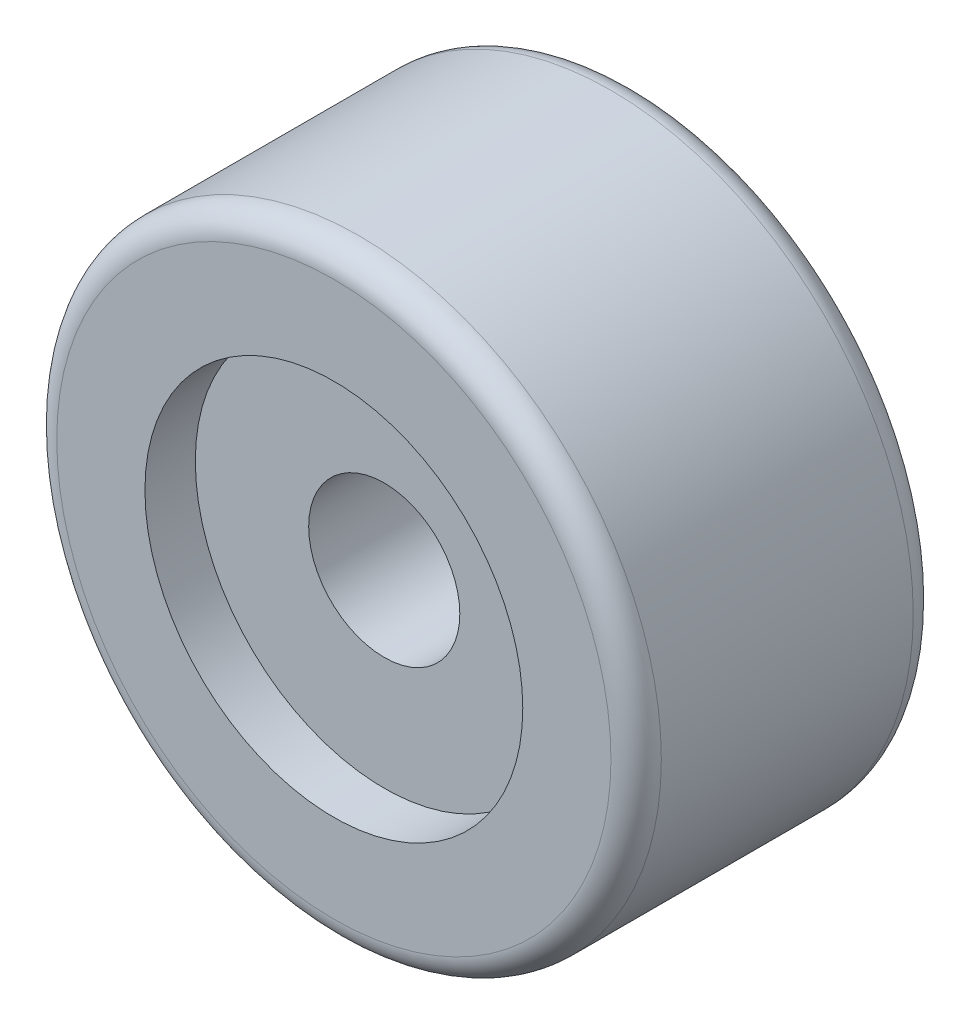
ISO-10303-21;
HEADER;
FILE_DESCRIPTION(('STEP AP214'),'2;1');
FILE_NAME('part.step','',(''),(''),'','','');
FILE_SCHEMA(('AUTOMOTIVE_DESIGN { 1 0 10303 214 1 1 1 1 }'));
ENDSEC;
DATA;
#1=APPLICATION_CONTEXT('core data for automotive mechanical design processes');
#2=APPLICATION_PROTOCOL_DEFINITION('international standard','automotive_design',2000,#1);
#3=PRODUCT_CONTEXT('',#1,'mechanical');
#4=PRODUCT('Part','Part','',(#3));
#5=PRODUCT_RELATED_PRODUCT_CATEGORY('part','',(#4));
#6=PRODUCT_DEFINITION_FORMATION('','',#4);
#7=PRODUCT_DEFINITION_CONTEXT('part definition',#1,'design');
#8=PRODUCT_DEFINITION('design','',#6,#7);
#9=PRODUCT_DEFINITION_SHAPE('','',#8);
#10=(LENGTH_UNIT() NAMED_UNIT(*) SI_UNIT(.MILLI.,.METRE.));
#11=(NAMED_UNIT(*) PLANE_ANGLE_UNIT() SI_UNIT($,.RADIAN.));
#12=(NAMED_UNIT(*) SI_UNIT($,.STERADIAN.) SOLID_ANGLE_UNIT());
#13=UNCERTAINTY_MEASURE_WITH_UNIT(LENGTH_MEASURE(1.E-05),#10,'distance_accuracy_value','');
#14=(GEOMETRIC_REPRESENTATION_CONTEXT(3) GLOBAL_UNCERTAINTY_ASSIGNED_CONTEXT((#13)) GLOBAL_UNIT_ASSIGNED_CONTEXT((#10,
#11,#12)) REPRESENTATION_CONTEXT('',''));
#15=CARTESIAN_POINT('',(0.,0.,0.));
#16=DIRECTION('',(0.,0.,1.));
#17=DIRECTION('',(1.,0.,0.));
#18=AXIS2_PLACEMENT_3D('',#15,#16,#17);
#19=CARTESIAN_POINT('',(0.,0.,6.));
#20=DIRECTION('',(0.,0.,-1.));
#21=DIRECTION('',(-1.,0.,0.));
#22=AXIS2_PLACEMENT_3D('',#19,#20,#21);
#23=CYLINDRICAL_SURFACE('',#22,1.5);
#24=CARTESIAN_POINT('',(0.,0.,5.));
#25=DIRECTION('',(0.,0.,1.));
#26=DIRECTION('',(1.,0.,0.));
#27=AXIS2_PLACEMENT_3D('',#24,#25,#26);
#28=CIRCLE('',#27,1.5);
#29=CARTESIAN_POINT('',(1.5,0.,5.));
#30=VERTEX_POINT('',#29);
#31=EDGE_CURVE('E53',#30,#30,#28,.T.);
#32=ORIENTED_EDGE('',*,*,#31,.T.);
#33=EDGE_LOOP('',(#32));
#34=FACE_BOUND('',#33,.T.);
#35=CARTESIAN_POINT('',(0.,0.,1.));
#36=DIRECTION('',(0.,0.,-1.));
#37=DIRECTION('',(-1.,0.,0.));
#38=AXIS2_PLACEMENT_3D('',#35,#36,#37);
#39=CIRCLE('',#38,1.5);
#40=CARTESIAN_POINT('',(-1.5,0.,1.));
#41=VERTEX_POINT('',#40);
#42=EDGE_CURVE('E54',#41,#41,#39,.T.);
#43=ORIENTED_EDGE('',*,*,#42,.T.);
#44=EDGE_LOOP('',(#43));
#45=FACE_BOUND('',#44,.T.);
#46=ADVANCED_FACE('F33',(#34,#45),#23,.F.);
#47=CARTESIAN_POINT('',(0.,0.,6.));
#48=DIRECTION('',(0.,0.,1.));
#49=DIRECTION('',(1.,0.,0.));
#50=AXIS2_PLACEMENT_3D('',#47,#48,#49);
#51=PLANE('',#50);
#52=CARTESIAN_POINT('',(0.,0.,6.));
#53=DIRECTION('',(0.,0.,1.));
#54=DIRECTION('',(1.,0.,0.));
#55=AXIS2_PLACEMENT_3D('',#52,#53,#54);
#56=CIRCLE('',#55,5.5);
#57=CARTESIAN_POINT('',(5.5,0.,6.));
#58=VERTEX_POINT('',#57);
#59=EDGE_CURVE('E10',#58,#58,#56,.T.);
#60=ORIENTED_EDGE('',*,*,#59,.T.);
#61=EDGE_LOOP('',(#60));
#62=FACE_BOUND('',#61,.T.);
#63=CARTESIAN_POINT('',(0.,0.,6.));
#64=DIRECTION('',(0.,0.,1.));
#65=DIRECTION('',(1.,0.,0.));
#66=AXIS2_PLACEMENT_3D('',#63,#64,#65);
#67=CIRCLE('',#66,3.75);
#68=CARTESIAN_POINT('',(3.75,0.,6.));
#69=VERTEX_POINT('',#68);
#70=EDGE_CURVE('E57',#69,#69,#67,.T.);
#71=ORIENTED_EDGE('',*,*,#70,.F.);
#72=EDGE_LOOP('',(#71));
#73=FACE_BOUND('',#72,.T.);
#74=ADVANCED_FACE('F84',(#62,#73),#51,.T.);
#75=CARTESIAN_POINT('',(0.,0.,0.));
#76=DIRECTION('',(0.,0.,1.));
#77=DIRECTION('',(1.,0.,0.));
#78=AXIS2_PLACEMENT_3D('',#75,#76,#77);
#79=PLANE('',#78);
#80=CARTESIAN_POINT('',(0.,0.,0.));
#81=DIRECTION('',(0.,0.,1.));
#82=DIRECTION('',(1.,0.,0.));
#83=AXIS2_PLACEMENT_3D('',#80,#81,#82);
#84=CIRCLE('',#83,5.5);
#85=CARTESIAN_POINT('',(5.5,0.,0.));
#86=VERTEX_POINT('',#85);
#87=EDGE_CURVE('E40',#86,#86,#84,.F.);
#88=ORIENTED_EDGE('',*,*,#87,.T.);
#89=EDGE_LOOP('',(#88));
#90=FACE_BOUND('',#89,.T.);
#91=CARTESIAN_POINT('',(0.,0.,0.));
#92=DIRECTION('',(0.,0.,-1.));
#93=DIRECTION('',(-1.,0.,0.));
#94=AXIS2_PLACEMENT_3D('',#91,#92,#93);
#95=CIRCLE('',#94,3.75);
#96=CARTESIAN_POINT('',(-3.75,0.,0.));
#97=VERTEX_POINT('',#96);
#98=EDGE_CURVE('E66',#97,#97,#95,.T.);
#99=ORIENTED_EDGE('',*,*,#98,.F.);
#100=EDGE_LOOP('',(#99));
#101=FACE_BOUND('',#100,.T.);
#102=ADVANCED_FACE('F81',(#90,#101),#79,.F.);
#103=CARTESIAN_POINT('',(0.,0.,6.));
#104=DIRECTION('',(0.,0.,-1.));
#105=DIRECTION('',(-1.,0.,0.));
#106=AXIS2_PLACEMENT_3D('',#103,#104,#105);
#107=CYLINDRICAL_SURFACE('',#106,6.);
#108=CARTESIAN_POINT('',(0.,0.,0.5));
#109=DIRECTION('',(0.,0.,1.));
#110=DIRECTION('',(1.,0.,0.));
#111=AXIS2_PLACEMENT_3D('',#108,#109,#110);
#112=CIRCLE('',#111,6.);
#113=CARTESIAN_POINT('',(6.,0.,0.5));
#114=VERTEX_POINT('',#113);
#115=EDGE_CURVE('E44',#114,#114,#112,.T.);
#116=ORIENTED_EDGE('',*,*,#115,.T.);
#117=EDGE_LOOP('',(#116));
#118=FACE_BOUND('',#117,.T.);
#119=CARTESIAN_POINT('',(0.,0.,5.5));
#120=DIRECTION('',(0.,0.,1.));
#121=DIRECTION('',(1.,0.,0.));
#122=AXIS2_PLACEMENT_3D('',#119,#120,#121);
#123=CIRCLE('',#122,6.);
#124=CARTESIAN_POINT('',(6.,0.,5.5));
#125=VERTEX_POINT('',#124);
#126=EDGE_CURVE('E48',#125,#125,#123,.F.);
#127=ORIENTED_EDGE('',*,*,#126,.T.);
#128=EDGE_LOOP('',(#127));
#129=FACE_BOUND('',#128,.T.);
#130=ADVANCED_FACE('F83',(#118,#129),#107,.T.);
#131=CARTESIAN_POINT('',(0.,0.,5.));
#132=DIRECTION('',(0.,0.,1.));
#133=DIRECTION('',(1.,0.,0.));
#134=AXIS2_PLACEMENT_3D('',#131,#132,#133);
#135=CYLINDRICAL_SURFACE('',#134,3.75);
#136=CARTESIAN_POINT('',(0.,0.,5.));
#137=DIRECTION('',(0.,0.,1.));
#138=DIRECTION('',(1.,0.,0.));
#139=AXIS2_PLACEMENT_3D('',#136,#137,#138);
#140=CIRCLE('',#139,3.75);
#141=CARTESIAN_POINT('',(3.75,0.,5.));
#142=VERTEX_POINT('',#141);
#143=EDGE_CURVE('E61',#142,#142,#140,.T.);
#144=ORIENTED_EDGE('',*,*,#143,.F.);
#145=EDGE_LOOP('',(#144));
#146=FACE_BOUND('',#145,.T.);
#147=ORIENTED_EDGE('',*,*,#70,.T.);
#148=EDGE_LOOP('',(#147));
#149=FACE_BOUND('',#148,.T.);
#150=ADVANCED_FACE('F90',(#146,#149),#135,.F.);
#151=CARTESIAN_POINT('',(0.,0.,5.));
#152=DIRECTION('',(0.,0.,1.));
#153=DIRECTION('',(1.,0.,0.));
#154=AXIS2_PLACEMENT_3D('',#151,#152,#153);
#155=PLANE('',#154);
#156=ORIENTED_EDGE('',*,*,#31,.F.);
#157=EDGE_LOOP('',(#156));
#158=FACE_BOUND('',#157,.T.);
#159=ORIENTED_EDGE('',*,*,#143,.T.);
#160=EDGE_LOOP('',(#159));
#161=FACE_BOUND('',#160,.T.);
#162=ADVANCED_FACE('F77',(#158,#161),#155,.T.);
#163=CARTESIAN_POINT('',(0.,0.,1.));
#164=DIRECTION('',(0.,0.,-1.));
#165=DIRECTION('',(-1.,0.,0.));
#166=AXIS2_PLACEMENT_3D('',#163,#164,#165);
#167=CYLINDRICAL_SURFACE('',#166,3.75);
#168=CARTESIAN_POINT('',(0.,0.,1.));
#169=DIRECTION('',(0.,0.,-1.));
#170=DIRECTION('',(-1.,0.,0.));
#171=AXIS2_PLACEMENT_3D('',#168,#169,#170);
#172=CIRCLE('',#171,3.75);
#173=CARTESIAN_POINT('',(-3.75,0.,1.));
#174=VERTEX_POINT('',#173);
#175=EDGE_CURVE('E58',#174,#174,#172,.T.);
#176=ORIENTED_EDGE('',*,*,#175,.F.);
#177=EDGE_LOOP('',(#176));
#178=FACE_BOUND('',#177,.T.);
#179=ORIENTED_EDGE('',*,*,#98,.T.);
#180=EDGE_LOOP('',(#179));
#181=FACE_BOUND('',#180,.T.);
#182=ADVANCED_FACE('F74',(#178,#181),#167,.F.);
#183=CARTESIAN_POINT('',(0.,0.,1.));
#184=DIRECTION('',(0.,0.,-1.));
#185=DIRECTION('',(-1.,0.,0.));
#186=AXIS2_PLACEMENT_3D('',#183,#184,#185);
#187=PLANE('',#186);
#188=ORIENTED_EDGE('',*,*,#42,.F.);
#189=EDGE_LOOP('',(#188));
#190=FACE_BOUND('',#189,.T.);
#191=ORIENTED_EDGE('',*,*,#175,.T.);
#192=EDGE_LOOP('',(#191));
#193=FACE_BOUND('',#192,.T.);
#194=ADVANCED_FACE('F72',(#190,#193),#187,.T.);
#195=CARTESIAN_POINT('',(0.,0.,0.5));
#196=DIRECTION('',(0.,0.,1.));
#197=DIRECTION('',(1.,0.,0.));
#198=AXIS2_PLACEMENT_3D('',#195,#196,#197);
#199=TOROIDAL_SURFACE('',#198,5.5,0.5);
#200=ORIENTED_EDGE('',*,*,#87,.F.);
#201=EDGE_LOOP('',(#200));
#202=FACE_BOUND('',#201,.T.);
#203=ORIENTED_EDGE('',*,*,#115,.F.);
#204=EDGE_LOOP('',(#203));
#205=FACE_BOUND('',#204,.T.);
#206=ADVANCED_FACE('F108',(#202,#205),#199,.T.);
#207=CARTESIAN_POINT('',(0.,0.,5.5));
#208=DIRECTION('',(0.,0.,1.));
#209=DIRECTION('',(1.,0.,0.));
#210=AXIS2_PLACEMENT_3D('',#207,#208,#209);
#211=TOROIDAL_SURFACE('',#210,5.5,0.5);
#212=ORIENTED_EDGE('',*,*,#126,.F.);
#213=EDGE_LOOP('',(#212));
#214=FACE_BOUND('',#213,.T.);
#215=ORIENTED_EDGE('',*,*,#59,.F.);
#216=EDGE_LOOP('',(#215));
#217=FACE_BOUND('',#216,.T.);
#218=ADVANCED_FACE('F35',(#214,#217),#211,.T.);
#219=CLOSED_SHELL('',(#46,#74,#102,#130,#150,#162,#182,#194,#206,#218));
#220=MANIFOLD_SOLID_BREP('B2',#219);
#221=ADVANCED_BREP_SHAPE_REPRESENTATION('',(#18,#220),#14);
#222=SHAPE_DEFINITION_REPRESENTATION(#9,#221);
ENDSEC;
END-ISO-10303-21;
